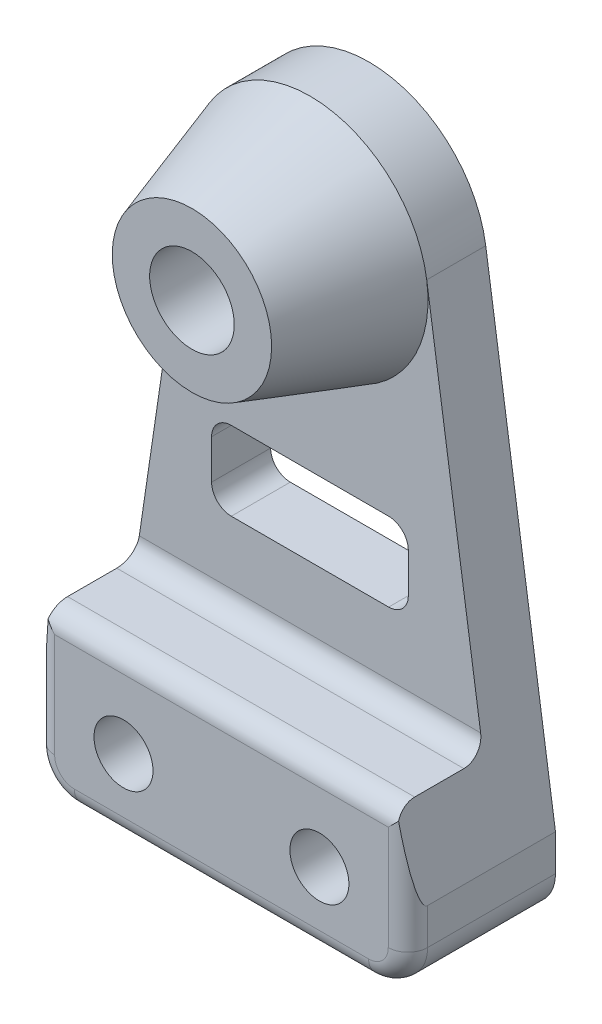
ISO-10303-21;
HEADER;
FILE_DESCRIPTION(('STEP AP214'),'2;1');
FILE_NAME('part.step','',(''),(''),'','','');
FILE_SCHEMA(('AUTOMOTIVE_DESIGN { 1 0 10303 214 1 1 1 1 }'));
ENDSEC;
DATA;
#1=APPLICATION_CONTEXT('core data for automotive mechanical design processes');
#2=APPLICATION_PROTOCOL_DEFINITION('international standard','automotive_design',2000,#1);
#3=PRODUCT_CONTEXT('',#1,'mechanical');
#4=PRODUCT('Part','Part','',(#3));
#5=PRODUCT_RELATED_PRODUCT_CATEGORY('part','',(#4));
#6=PRODUCT_DEFINITION_FORMATION('','',#4);
#7=PRODUCT_DEFINITION_CONTEXT('part definition',#1,'design');
#8=PRODUCT_DEFINITION('design','',#6,#7);
#9=PRODUCT_DEFINITION_SHAPE('','',#8);
#10=(LENGTH_UNIT() NAMED_UNIT(*) SI_UNIT(.MILLI.,.METRE.));
#11=(NAMED_UNIT(*) PLANE_ANGLE_UNIT() SI_UNIT($,.RADIAN.));
#12=(NAMED_UNIT(*) SI_UNIT($,.STERADIAN.) SOLID_ANGLE_UNIT());
#13=UNCERTAINTY_MEASURE_WITH_UNIT(LENGTH_MEASURE(1.E-05),#10,'distance_accuracy_value','');
#14=(GEOMETRIC_REPRESENTATION_CONTEXT(3) GLOBAL_UNCERTAINTY_ASSIGNED_CONTEXT((#13)) GLOBAL_UNIT_ASSIGNED_CONTEXT((#10,
#11,#12)) REPRESENTATION_CONTEXT('',''));
#15=CARTESIAN_POINT('',(0.,0.,0.));
#16=DIRECTION('',(0.,0.,1.));
#17=DIRECTION('',(1.,0.,0.));
#18=AXIS2_PLACEMENT_3D('',#15,#16,#17);
#19=CARTESIAN_POINT('',(0.,0.,3.));
#20=DIRECTION('',(0.,0.,1.));
#21=DIRECTION('',(1.,0.,0.));
#22=AXIS2_PLACEMENT_3D('',#19,#20,#21);
#23=PLANE('',#22);
#24=CARTESIAN_POINT('',(-4.,-11.5,3.));
#25=DIRECTION('',(0.,0.,1.));
#26=DIRECTION('',(1.,0.,0.));
#27=AXIS2_PLACEMENT_3D('',#24,#25,#26);
#28=CIRCLE('',#27,0.999999999999999);
#29=CARTESIAN_POINT('',(-4.,-10.5,3.));
#30=VERTEX_POINT('',#29);
#31=CARTESIAN_POINT('',(-5.,-11.5,3.));
#32=VERTEX_POINT('',#31);
#33=EDGE_CURVE('E215',#30,#32,#28,.T.);
#34=ORIENTED_EDGE('',*,*,#33,.F.);
#35=DIRECTION('',(-1.,0.,0.));
#36=VECTOR('',#35,1.);
#37=CARTESIAN_POINT('',(-4.,-10.5,3.));
#38=LINE('',#37,#36);
#39=CARTESIAN_POINT('',(4.,-10.5,3.));
#40=VERTEX_POINT('',#39);
#41=EDGE_CURVE('E234',#40,#30,#38,.T.);
#42=ORIENTED_EDGE('',*,*,#41,.F.);
#43=CARTESIAN_POINT('',(4.,-11.5,3.));
#44=DIRECTION('',(0.,0.,1.));
#45=DIRECTION('',(-1.,0.,0.));
#46=AXIS2_PLACEMENT_3D('',#43,#44,#45);
#47=CIRCLE('',#46,0.999999999999999);
#48=CARTESIAN_POINT('',(5.,-11.5,3.));
#49=VERTEX_POINT('',#48);
#50=EDGE_CURVE('E231',#49,#40,#47,.T.);
#51=ORIENTED_EDGE('',*,*,#50,.F.);
#52=DIRECTION('',(0.,1.,0.));
#53=VECTOR('',#52,1.);
#54=CARTESIAN_POINT('',(5.,-11.5,3.));
#55=LINE('',#54,#53);
#56=CARTESIAN_POINT('',(5.,-13.5,3.));
#57=VERTEX_POINT('',#56);
#58=EDGE_CURVE('E228',#57,#49,#55,.T.);
#59=ORIENTED_EDGE('',*,*,#58,.F.);
#60=CARTESIAN_POINT('',(4.,-13.5,3.));
#61=DIRECTION('',(0.,0.,1.));
#62=DIRECTION('',(1.,0.,0.));
#63=AXIS2_PLACEMENT_3D('',#60,#61,#62);
#64=CIRCLE('',#63,1.);
#65=CARTESIAN_POINT('',(4.,-14.5,3.));
#66=VERTEX_POINT('',#65);
#67=EDGE_CURVE('E222',#66,#57,#64,.T.);
#68=ORIENTED_EDGE('',*,*,#67,.F.);
#69=DIRECTION('',(1.,0.,0.));
#70=VECTOR('',#69,1.);
#71=CARTESIAN_POINT('',(-4.,-14.5,3.));
#72=LINE('',#71,#70);
#73=CARTESIAN_POINT('',(-4.,-14.5,3.));
#74=VERTEX_POINT('',#73);
#75=EDGE_CURVE('E220',#74,#66,#72,.T.);
#76=ORIENTED_EDGE('',*,*,#75,.F.);
#77=CARTESIAN_POINT('',(-4.,-13.5,3.));
#78=DIRECTION('',(0.,0.,1.));
#79=DIRECTION('',(-1.,0.,0.));
#80=AXIS2_PLACEMENT_3D('',#77,#78,#79);
#81=CIRCLE('',#80,1.);
#82=CARTESIAN_POINT('',(-5.,-13.5,3.));
#83=VERTEX_POINT('',#82);
#84=EDGE_CURVE('E199',#83,#74,#81,.T.);
#85=ORIENTED_EDGE('',*,*,#84,.F.);
#86=DIRECTION('',(0.,-1.,0.));
#87=VECTOR('',#86,1.);
#88=CARTESIAN_POINT('',(-5.,-11.5,3.));
#89=LINE('',#88,#87);
#90=EDGE_CURVE('E210',#32,#83,#89,.T.);
#91=ORIENTED_EDGE('',*,*,#90,.F.);
#92=EDGE_LOOP('',(#34,#42,#51,#59,#68,#76,#85,#91));
#93=FACE_BOUND('',#92,.T.);
#94=DIRECTION('',(-0.14593962685344,-0.989293498065098,0.));
#95=VECTOR('',#94,1.);
#96=CARTESIAN_POINT('',(-5.93576098839059,0.875637761120637,3.));
#97=LINE('',#96,#95);
#98=CARTESIAN_POINT('',(-5.93576098839059,0.875637761120637,3.));
#99=VERTEX_POINT('',#98);
#100=CARTESIAN_POINT('',(-8.67602123342884,-17.7,3.));
#101=VERTEX_POINT('',#100);
#102=EDGE_CURVE('E269',#99,#101,#97,.T.);
#103=ORIENTED_EDGE('',*,*,#102,.T.);
#104=DIRECTION('',(-1.,0.,0.));
#105=VECTOR('',#104,1.);
#106=CARTESIAN_POINT('',(0.,-17.7,3.));
#107=LINE('',#106,#105);
#108=CARTESIAN_POINT('',(8.67602123342884,-17.7,3.));
#109=VERTEX_POINT('',#108);
#110=EDGE_CURVE('E348',#101,#109,#107,.F.);
#111=ORIENTED_EDGE('',*,*,#110,.T.);
#112=DIRECTION('',(-0.14593962685344,0.989293498065098,0.));
#113=VECTOR('',#112,1.);
#114=CARTESIAN_POINT('',(9.48,-23.15,3.));
#115=LINE('',#114,#113);
#116=CARTESIAN_POINT('',(5.93576098839059,0.875637761120639,3.));
#117=VERTEX_POINT('',#116);
#118=EDGE_CURVE('E272',#109,#117,#115,.T.);
#119=ORIENTED_EDGE('',*,*,#118,.T.);
#120=CARTESIAN_POINT('',(0.,0.,3.));
#121=DIRECTION('',(0.,0.,1.));
#122=DIRECTION('',(1.,0.,0.));
#123=AXIS2_PLACEMENT_3D('',#120,#121,#122);
#124=CIRCLE('',#123,6.);
#125=EDGE_CURVE('E256',#99,#117,#124,.T.);
#126=ORIENTED_EDGE('',*,*,#125,.F.);
#127=EDGE_LOOP('',(#103,#111,#119,#126));
#128=FACE_BOUND('',#127,.T.);
#129=ADVANCED_FACE('F38',(#93,#128),#23,.T.);
#130=CARTESIAN_POINT('',(0.,0.,0.));
#131=DIRECTION('',(0.,0.,1.));
#132=DIRECTION('',(1.,0.,0.));
#133=AXIS2_PLACEMENT_3D('',#130,#131,#132);
#134=PLANE('',#133);
#135=DIRECTION('',(1.,0.,0.));
#136=VECTOR('',#135,1.);
#137=CARTESIAN_POINT('',(-4.,-10.5,0.));
#138=LINE('',#137,#136);
#139=CARTESIAN_POINT('',(-4.,-10.5,0.));
#140=VERTEX_POINT('',#139);
#141=CARTESIAN_POINT('',(4.,-10.5,0.));
#142=VERTEX_POINT('',#141);
#143=EDGE_CURVE('E507',#140,#142,#138,.T.);
#144=ORIENTED_EDGE('',*,*,#143,.F.);
#145=CARTESIAN_POINT('',(-4.,-11.5,0.));
#146=DIRECTION('',(0.,0.,1.));
#147=DIRECTION('',(1.,0.,0.));
#148=AXIS2_PLACEMENT_3D('',#145,#146,#147);
#149=CIRCLE('',#148,0.999999999999999);
#150=CARTESIAN_POINT('',(-5.,-11.5,0.));
#151=VERTEX_POINT('',#150);
#152=EDGE_CURVE('E252',#151,#140,#149,.F.);
#153=ORIENTED_EDGE('',*,*,#152,.F.);
#154=DIRECTION('',(0.,1.,0.));
#155=VECTOR('',#154,1.);
#156=CARTESIAN_POINT('',(-5.,-11.5,0.));
#157=LINE('',#156,#155);
#158=CARTESIAN_POINT('',(-5.,-13.5,0.));
#159=VERTEX_POINT('',#158);
#160=EDGE_CURVE('E249',#159,#151,#157,.T.);
#161=ORIENTED_EDGE('',*,*,#160,.F.);
#162=CARTESIAN_POINT('',(-4.,-13.5,0.));
#163=DIRECTION('',(0.,0.,1.));
#164=DIRECTION('',(1.,0.,0.));
#165=AXIS2_PLACEMENT_3D('',#162,#163,#164);
#166=CIRCLE('',#165,1.);
#167=CARTESIAN_POINT('',(-4.,-14.5,0.));
#168=VERTEX_POINT('',#167);
#169=EDGE_CURVE('E202',#168,#159,#166,.F.);
#170=ORIENTED_EDGE('',*,*,#169,.F.);
#171=DIRECTION('',(-1.,0.,0.));
#172=VECTOR('',#171,1.);
#173=CARTESIAN_POINT('',(-4.,-14.5,0.));
#174=LINE('',#173,#172);
#175=CARTESIAN_POINT('',(4.,-14.5,0.));
#176=VERTEX_POINT('',#175);
#177=EDGE_CURVE('E499',#176,#168,#174,.T.);
#178=ORIENTED_EDGE('',*,*,#177,.F.);
#179=CARTESIAN_POINT('',(4.,-13.5,0.));
#180=DIRECTION('',(0.,0.,1.));
#181=DIRECTION('',(1.,0.,0.));
#182=AXIS2_PLACEMENT_3D('',#179,#180,#181);
#183=CIRCLE('',#182,1.);
#184=CARTESIAN_POINT('',(5.,-13.5,0.));
#185=VERTEX_POINT('',#184);
#186=EDGE_CURVE('E501',#185,#176,#183,.F.);
#187=ORIENTED_EDGE('',*,*,#186,.F.);
#188=DIRECTION('',(0.,-1.,0.));
#189=VECTOR('',#188,1.);
#190=CARTESIAN_POINT('',(5.,-11.5,0.));
#191=LINE('',#190,#189);
#192=CARTESIAN_POINT('',(5.,-11.5,0.));
#193=VERTEX_POINT('',#192);
#194=EDGE_CURVE('E503',#193,#185,#191,.T.);
#195=ORIENTED_EDGE('',*,*,#194,.F.);
#196=CARTESIAN_POINT('',(4.,-11.5,0.));
#197=DIRECTION('',(0.,0.,1.));
#198=DIRECTION('',(1.,0.,0.));
#199=AXIS2_PLACEMENT_3D('',#196,#197,#198);
#200=CIRCLE('',#199,0.999999999999999);
#201=EDGE_CURVE('E505',#142,#193,#200,.F.);
#202=ORIENTED_EDGE('',*,*,#201,.F.);
#203=EDGE_LOOP('',(#144,#153,#161,#170,#178,#187,#195,#202));
#204=FACE_BOUND('',#203,.T.);
#205=CARTESIAN_POINT('',(0.,0.,0.));
#206=DIRECTION('',(0.,0.,1.));
#207=DIRECTION('',(1.,0.,0.));
#208=AXIS2_PLACEMENT_3D('',#205,#206,#207);
#209=CIRCLE('',#208,6.);
#210=CARTESIAN_POINT('',(5.93576098839059,0.875637761120637,0.));
#211=VERTEX_POINT('',#210);
#212=CARTESIAN_POINT('',(-5.93576098839059,0.875637761120637,0.));
#213=VERTEX_POINT('',#212);
#214=EDGE_CURVE('E268',#211,#213,#209,.T.);
#215=ORIENTED_EDGE('',*,*,#214,.F.);
#216=DIRECTION('',(-0.14593962685344,0.989293498065098,0.));
#217=VECTOR('',#216,1.);
#218=CARTESIAN_POINT('',(9.48,-23.15,0.));
#219=LINE('',#218,#217);
#220=CARTESIAN_POINT('',(9.48,-23.15,0.));
#221=VERTEX_POINT('',#220);
#222=EDGE_CURVE('E273',#221,#211,#219,.T.);
#223=ORIENTED_EDGE('',*,*,#222,.F.);
#224=DIRECTION('',(0.,1.,0.));
#225=VECTOR('',#224,1.);
#226=CARTESIAN_POINT('',(9.48,-23.15,0.));
#227=LINE('',#226,#225);
#228=CARTESIAN_POINT('',(9.47999999999998,-25.,0.));
#229=VERTEX_POINT('',#228);
#230=EDGE_CURVE('E294',#229,#221,#227,.T.);
#231=ORIENTED_EDGE('',*,*,#230,.F.);
#232=CARTESIAN_POINT('',(7.47999999999999,-25.,0.));
#233=DIRECTION('',(0.,0.,1.));
#234=DIRECTION('',(-1.,0.,0.));
#235=AXIS2_PLACEMENT_3D('',#232,#233,#234);
#236=CIRCLE('',#235,2.);
#237=CARTESIAN_POINT('',(7.47999999999999,-27.,0.));
#238=VERTEX_POINT('',#237);
#239=EDGE_CURVE('E291',#238,#229,#236,.T.);
#240=ORIENTED_EDGE('',*,*,#239,.F.);
#241=DIRECTION('',(1.,0.,0.));
#242=VECTOR('',#241,1.);
#243=CARTESIAN_POINT('',(-7.47999999999998,-27.,0.));
#244=LINE('',#243,#242);
#245=CARTESIAN_POINT('',(-7.47999999999998,-27.,0.));
#246=VERTEX_POINT('',#245);
#247=EDGE_CURVE('E288',#246,#238,#244,.T.);
#248=ORIENTED_EDGE('',*,*,#247,.F.);
#249=CARTESIAN_POINT('',(-7.47999999999998,-25.,0.));
#250=DIRECTION('',(0.,0.,1.));
#251=DIRECTION('',(-1.,0.,0.));
#252=AXIS2_PLACEMENT_3D('',#249,#250,#251);
#253=CIRCLE('',#252,2.);
#254=CARTESIAN_POINT('',(-9.47999999999998,-25.,0.));
#255=VERTEX_POINT('',#254);
#256=EDGE_CURVE('E285',#255,#246,#253,.T.);
#257=ORIENTED_EDGE('',*,*,#256,.F.);
#258=DIRECTION('',(0.,-1.,0.));
#259=VECTOR('',#258,1.);
#260=CARTESIAN_POINT('',(-9.48,-23.15,0.));
#261=LINE('',#260,#259);
#262=CARTESIAN_POINT('',(-9.48,-23.15,0.));
#263=VERTEX_POINT('',#262);
#264=EDGE_CURVE('E282',#263,#255,#261,.T.);
#265=ORIENTED_EDGE('',*,*,#264,.F.);
#266=DIRECTION('',(-0.14593962685344,-0.989293498065098,0.));
#267=VECTOR('',#266,1.);
#268=CARTESIAN_POINT('',(-5.93576098839059,0.875637761120637,0.));
#269=LINE('',#268,#267);
#270=EDGE_CURVE('E279',#213,#263,#269,.T.);
#271=ORIENTED_EDGE('',*,*,#270,.F.);
#272=EDGE_LOOP('',(#215,#223,#231,#240,#248,#257,#265,#271));
#273=FACE_BOUND('',#272,.T.);
#274=CARTESIAN_POINT('',(0.,0.,0.));
#275=DIRECTION('',(0.,0.,1.));
#276=DIRECTION('',(1.,0.,0.));
#277=AXIS2_PLACEMENT_3D('',#274,#275,#276);
#278=CIRCLE('',#277,2.15);
#279=CARTESIAN_POINT('',(2.15,0.,0.));
#280=VERTEX_POINT('',#279);
#281=EDGE_CURVE('E265',#280,#280,#278,.T.);
#282=ORIENTED_EDGE('',*,*,#281,.T.);
#283=EDGE_LOOP('',(#282));
#284=FACE_BOUND('',#283,.T.);
#285=CARTESIAN_POINT('',(4.98,-23.2,0.));
#286=DIRECTION('',(0.,0.,1.));
#287=DIRECTION('',(1.,0.,0.));
#288=AXIS2_PLACEMENT_3D('',#285,#286,#287);
#289=CIRCLE('',#288,1.5);
#290=CARTESIAN_POINT('',(6.48,-23.2,0.));
#291=VERTEX_POINT('',#290);
#292=EDGE_CURVE('E262',#291,#291,#289,.T.);
#293=ORIENTED_EDGE('',*,*,#292,.T.);
#294=EDGE_LOOP('',(#293));
#295=FACE_BOUND('',#294,.T.);
#296=CARTESIAN_POINT('',(-4.98,-23.2,0.));
#297=DIRECTION('',(0.,0.,1.));
#298=DIRECTION('',(1.,0.,0.));
#299=AXIS2_PLACEMENT_3D('',#296,#297,#298);
#300=CIRCLE('',#299,1.5);
#301=CARTESIAN_POINT('',(-3.48,-23.2,0.));
#302=VERTEX_POINT('',#301);
#303=EDGE_CURVE('E255',#302,#302,#300,.T.);
#304=ORIENTED_EDGE('',*,*,#303,.T.);
#305=EDGE_LOOP('',(#304));
#306=FACE_BOUND('',#305,.T.);
#307=ADVANCED_FACE('F386',(#204,#273,#284,#295,#306),#134,.F.);
#308=CARTESIAN_POINT('',(0.,0.,3.));
#309=DIRECTION('',(0.,0.,-1.));
#310=DIRECTION('',(-1.,0.,0.));
#311=AXIS2_PLACEMENT_3D('',#308,#309,#310);
#312=CYLINDRICAL_SURFACE('',#311,6.);
#313=DIRECTION('',(0.,0.,-1.));
#314=VECTOR('',#313,1.);
#315=CARTESIAN_POINT('',(-5.93576098839059,0.875637761120637,3.));
#316=LINE('',#315,#314);
#317=EDGE_CURVE('E259',#99,#213,#316,.T.);
#318=ORIENTED_EDGE('',*,*,#317,.F.);
#319=CARTESIAN_POINT('',(0.,0.,2.99999999999996));
#320=DIRECTION('',(0.,0.,1.));
#321=DIRECTION('',(1.,0.,0.));
#322=AXIS2_PLACEMENT_3D('',#319,#320,#321);
#323=CIRCLE('',#322,6.);
#324=EDGE_CURVE('E11',#99,#117,#323,.F.);
#325=ORIENTED_EDGE('',*,*,#324,.T.);
#326=DIRECTION('',(0.,0.,-1.));
#327=VECTOR('',#326,1.);
#328=CARTESIAN_POINT('',(5.93576098839059,0.875637761120637,3.));
#329=LINE('',#328,#327);
#330=EDGE_CURVE('E276',#117,#211,#329,.T.);
#331=ORIENTED_EDGE('',*,*,#330,.T.);
#332=ORIENTED_EDGE('',*,*,#214,.T.);
#333=EDGE_LOOP('',(#318,#325,#331,#332));
#334=FACE_BOUND('',#333,.T.);
#335=ADVANCED_FACE('F391',(#334),#312,.T.);
#336=CARTESIAN_POINT('',(-5.93576098839059,0.875637761120637,3.));
#337=DIRECTION('',(0.989293498065098,-0.14593962685344,0.));
#338=DIRECTION('',(0.14593962685344,0.989293498065098,0.));
#339=AXIS2_PLACEMENT_3D('',#336,#337,#338);
#340=PLANE('',#339);
#341=DIRECTION('',(0.,0.,-1.));
#342=VECTOR('',#341,1.);
#343=CARTESIAN_POINT('',(-9.48,-23.15,3.));
#344=LINE('',#343,#342);
#345=CARTESIAN_POINT('',(-9.48,-23.15,6.5));
#346=VERTEX_POINT('',#345);
#347=EDGE_CURVE('E310',#346,#263,#344,.T.);
#348=ORIENTED_EDGE('',*,*,#347,.F.);
#349=CARTESIAN_POINT('',(-8.48000000000007,-16.3712140088687,6.5));
#350=DIRECTION('',(0.989293498065098,-0.14593962685344,0.));
#351=DIRECTION('',(0.14593962685344,0.989293498065098,0.));
#352=AXIS2_PLACEMENT_3D('',#349,#350,#351);
#353=ELLIPSE('',#352,6.85214853265446,1.);
#354=CARTESIAN_POINT('',(-8.90793129865339,-19.2720687013466,7.40381126549344));
#355=VERTEX_POINT('',#354);
#356=EDGE_CURVE('E331',#346,#355,#353,.F.);
#357=ORIENTED_EDGE('',*,*,#356,.T.);
#358=CARTESIAN_POINT('',(-8.97105931290449,-19.7,6.5));
#359=DIRECTION('',(0.989293498065098,-0.14593962685344,0.));
#360=DIRECTION('',(0.14593962685344,0.989293498065098,0.));
#361=AXIS2_PLACEMENT_3D('',#358,#359,#360);
#362=ELLIPSE('',#361,1.01082237167821,1.);
#363=CARTESIAN_POINT('',(-8.82354027316667,-18.7,6.5));
#364=VERTEX_POINT('',#363);
#365=EDGE_CURVE('E329',#355,#364,#362,.F.);
#366=ORIENTED_EDGE('',*,*,#365,.T.);
#367=DIRECTION('',(0.,0.,-1.));
#368=VECTOR('',#367,1.);
#369=CARTESIAN_POINT('',(-8.82354027316667,-18.7,7.5));
#370=LINE('',#369,#368);
#371=CARTESIAN_POINT('',(-8.82354027316667,-18.7,4.));
#372=VERTEX_POINT('',#371);
#373=EDGE_CURVE('E486',#364,#372,#370,.T.);
#374=ORIENTED_EDGE('',*,*,#373,.T.);
#375=CARTESIAN_POINT('',(-8.67602123342884,-17.7,4.));
#376=DIRECTION('',(0.989293498065098,-0.14593962685344,0.));
#377=DIRECTION('',(-0.14593962685344,-0.989293498065098,0.));
#378=AXIS2_PLACEMENT_3D('',#375,#376,#377);
#379=ELLIPSE('',#378,1.01082237167821,1.);
#380=EDGE_CURVE('E350',#372,#101,#379,.T.);
#381=ORIENTED_EDGE('',*,*,#380,.T.);
#382=ORIENTED_EDGE('',*,*,#102,.F.);
#383=ORIENTED_EDGE('',*,*,#317,.T.);
#384=ORIENTED_EDGE('',*,*,#270,.T.);
#385=EDGE_LOOP('',(#348,#357,#366,#374,#381,#382,#383,#384));
#386=FACE_BOUND('',#385,.T.);
#387=ADVANCED_FACE('F419',(#386),#340,.F.);
#388=CARTESIAN_POINT('',(-9.48,-23.15,3.));
#389=DIRECTION('',(1.,0.,0.));
#390=DIRECTION('',(0.,1.,0.));
#391=AXIS2_PLACEMENT_3D('',#388,#389,#390);
#392=PLANE('',#391);
#393=DIRECTION('',(0.,0.,-1.));
#394=VECTOR('',#393,1.);
#395=CARTESIAN_POINT('',(-9.47999999999998,-25.,3.));
#396=LINE('',#395,#394);
#397=CARTESIAN_POINT('',(-9.47999999999998,-25.,6.5));
#398=VERTEX_POINT('',#397);
#399=EDGE_CURVE('E308',#398,#255,#396,.T.);
#400=ORIENTED_EDGE('',*,*,#399,.F.);
#401=DIRECTION('',(0.,-1.,0.));
#402=VECTOR('',#401,1.);
#403=CARTESIAN_POINT('',(-9.48,-23.1499999999994,6.5));
#404=LINE('',#403,#402);
#405=EDGE_CURVE('E326',#398,#346,#404,.F.);
#406=ORIENTED_EDGE('',*,*,#405,.T.);
#407=ORIENTED_EDGE('',*,*,#347,.T.);
#408=ORIENTED_EDGE('',*,*,#264,.T.);
#409=EDGE_LOOP('',(#400,#406,#407,#408));
#410=FACE_BOUND('',#409,.T.);
#411=ADVANCED_FACE('F415',(#410),#392,.F.);
#412=CARTESIAN_POINT('',(-7.47999999999998,-25.,3.));
#413=DIRECTION('',(0.,0.,-1.));
#414=DIRECTION('',(-1.,0.,0.));
#415=AXIS2_PLACEMENT_3D('',#412,#413,#414);
#416=CYLINDRICAL_SURFACE('',#415,2.);
#417=DIRECTION('',(0.,0.,-1.));
#418=VECTOR('',#417,1.);
#419=CARTESIAN_POINT('',(-7.47999999999998,-27.,3.));
#420=LINE('',#419,#418);
#421=CARTESIAN_POINT('',(-7.47999999999998,-27.,6.5));
#422=VERTEX_POINT('',#421);
#423=EDGE_CURVE('E306',#422,#246,#420,.T.);
#424=ORIENTED_EDGE('',*,*,#423,.F.);
#425=CARTESIAN_POINT('',(-7.47999999999998,-25.,6.5));
#426=DIRECTION('',(0.,0.,1.));
#427=DIRECTION('',(1.,0.,0.));
#428=AXIS2_PLACEMENT_3D('',#425,#426,#427);
#429=CIRCLE('',#428,2.);
#430=EDGE_CURVE('E333',#422,#398,#429,.F.);
#431=ORIENTED_EDGE('',*,*,#430,.T.);
#432=ORIENTED_EDGE('',*,*,#399,.T.);
#433=ORIENTED_EDGE('',*,*,#256,.T.);
#434=EDGE_LOOP('',(#424,#431,#432,#433));
#435=FACE_BOUND('',#434,.T.);
#436=ADVANCED_FACE('F411',(#435),#416,.T.);
#437=CARTESIAN_POINT('',(-7.47999999999998,-27.,3.));
#438=DIRECTION('',(0.,1.,0.));
#439=DIRECTION('',(0.,0.,1.));
#440=AXIS2_PLACEMENT_3D('',#437,#438,#439);
#441=PLANE('',#440);
#442=DIRECTION('',(0.,0.,-1.));
#443=VECTOR('',#442,1.);
#444=CARTESIAN_POINT('',(7.47999999999999,-27.,3.));
#445=LINE('',#444,#443);
#446=CARTESIAN_POINT('',(7.47999999999999,-27.,6.5));
#447=VERTEX_POINT('',#446);
#448=EDGE_CURVE('E304',#447,#238,#445,.T.);
#449=ORIENTED_EDGE('',*,*,#448,.F.);
#450=DIRECTION('',(1.,0.,0.));
#451=VECTOR('',#450,1.);
#452=CARTESIAN_POINT('',(-7.48000000000051,-27.,6.5));
#453=LINE('',#452,#451);
#454=EDGE_CURVE('E341',#447,#422,#453,.F.);
#455=ORIENTED_EDGE('',*,*,#454,.T.);
#456=ORIENTED_EDGE('',*,*,#423,.T.);
#457=ORIENTED_EDGE('',*,*,#247,.T.);
#458=EDGE_LOOP('',(#449,#455,#456,#457));
#459=FACE_BOUND('',#458,.T.);
#460=ADVANCED_FACE('F408',(#459),#441,.F.);
#461=CARTESIAN_POINT('',(7.47999999999999,-25.,3.));
#462=DIRECTION('',(0.,0.,-1.));
#463=DIRECTION('',(-1.,0.,0.));
#464=AXIS2_PLACEMENT_3D('',#461,#462,#463);
#465=CYLINDRICAL_SURFACE('',#464,2.);
#466=DIRECTION('',(0.,0.,-1.));
#467=VECTOR('',#466,1.);
#468=CARTESIAN_POINT('',(9.47999999999998,-25.,3.));
#469=LINE('',#468,#467);
#470=CARTESIAN_POINT('',(9.47999999999998,-25.,6.5));
#471=VERTEX_POINT('',#470);
#472=EDGE_CURVE('E302',#471,#229,#469,.T.);
#473=ORIENTED_EDGE('',*,*,#472,.F.);
#474=CARTESIAN_POINT('',(7.47999999999999,-25.,6.5));
#475=DIRECTION('',(0.,0.,1.));
#476=DIRECTION('',(1.,0.,0.));
#477=AXIS2_PLACEMENT_3D('',#474,#475,#476);
#478=CIRCLE('',#477,2.);
#479=EDGE_CURVE('E53',#471,#447,#478,.F.);
#480=ORIENTED_EDGE('',*,*,#479,.T.);
#481=ORIENTED_EDGE('',*,*,#448,.T.);
#482=ORIENTED_EDGE('',*,*,#239,.T.);
#483=EDGE_LOOP('',(#473,#480,#481,#482));
#484=FACE_BOUND('',#483,.T.);
#485=ADVANCED_FACE('F405',(#484),#465,.T.);
#486=CARTESIAN_POINT('',(9.48,-23.15,3.));
#487=DIRECTION('',(-1.,0.,0.));
#488=DIRECTION('',(0.,-1.,0.));
#489=AXIS2_PLACEMENT_3D('',#486,#487,#488);
#490=PLANE('',#489);
#491=DIRECTION('',(0.,0.,-1.));
#492=VECTOR('',#491,1.);
#493=CARTESIAN_POINT('',(9.48,-23.15,3.));
#494=LINE('',#493,#492);
#495=CARTESIAN_POINT('',(9.48,-23.15,6.5));
#496=VERTEX_POINT('',#495);
#497=EDGE_CURVE('E300',#496,#221,#494,.T.);
#498=ORIENTED_EDGE('',*,*,#497,.F.);
#499=DIRECTION('',(0.,1.,0.));
#500=VECTOR('',#499,1.);
#501=CARTESIAN_POINT('',(9.47999999999998,-25.,6.5));
#502=LINE('',#501,#500);
#503=EDGE_CURVE('E61',#496,#471,#502,.F.);
#504=ORIENTED_EDGE('',*,*,#503,.T.);
#505=ORIENTED_EDGE('',*,*,#472,.T.);
#506=ORIENTED_EDGE('',*,*,#230,.T.);
#507=EDGE_LOOP('',(#498,#504,#505,#506));
#508=FACE_BOUND('',#507,.T.);
#509=ADVANCED_FACE('F401',(#508),#490,.F.);
#510=CARTESIAN_POINT('',(9.48,-23.15,3.));
#511=DIRECTION('',(-0.989293498065098,-0.14593962685344,0.));
#512=DIRECTION('',(0.14593962685344,-0.989293498065098,0.));
#513=AXIS2_PLACEMENT_3D('',#510,#511,#512);
#514=PLANE('',#513);
#515=CARTESIAN_POINT('',(8.97105931290449,-19.7,6.5));
#516=DIRECTION('',(-0.989293498065098,-0.14593962685344,0.));
#517=DIRECTION('',(0.14593962685344,-0.989293498065098,0.));
#518=AXIS2_PLACEMENT_3D('',#515,#516,#517);
#519=ELLIPSE('',#518,1.01082237167821,1.);
#520=CARTESIAN_POINT('',(8.82354027316666,-18.7,6.5));
#521=VERTEX_POINT('',#520);
#522=CARTESIAN_POINT('',(8.90793129865339,-19.2720687013466,7.40381126549344));
#523=VERTEX_POINT('',#522);
#524=EDGE_CURVE('E335',#521,#523,#519,.F.);
#525=ORIENTED_EDGE('',*,*,#524,.T.);
#526=CARTESIAN_POINT('',(8.48000000000006,-16.3712140088686,6.5));
#527=DIRECTION('',(-0.989293498065098,-0.14593962685344,0.));
#528=DIRECTION('',(0.14593962685344,-0.989293498065098,0.));
#529=AXIS2_PLACEMENT_3D('',#526,#527,#528);
#530=ELLIPSE('',#529,6.8521485326545,1.);
#531=EDGE_CURVE('E337',#523,#496,#530,.F.);
#532=ORIENTED_EDGE('',*,*,#531,.T.);
#533=ORIENTED_EDGE('',*,*,#497,.T.);
#534=ORIENTED_EDGE('',*,*,#222,.T.);
#535=ORIENTED_EDGE('',*,*,#330,.F.);
#536=ORIENTED_EDGE('',*,*,#118,.F.);
#537=CARTESIAN_POINT('',(8.67602123342884,-17.7,4.));
#538=DIRECTION('',(-0.989293498065098,-0.14593962685344,0.));
#539=DIRECTION('',(-0.14593962685344,0.989293498065098,0.));
#540=AXIS2_PLACEMENT_3D('',#537,#538,#539);
#541=ELLIPSE('',#540,1.01082237167821,1.);
#542=CARTESIAN_POINT('',(8.82354027316666,-18.7,4.));
#543=VERTEX_POINT('',#542);
#544=EDGE_CURVE('E352',#109,#543,#541,.T.);
#545=ORIENTED_EDGE('',*,*,#544,.T.);
#546=DIRECTION('',(0.,0.,-1.));
#547=VECTOR('',#546,1.);
#548=CARTESIAN_POINT('',(8.82354027316666,-18.7,7.5));
#549=LINE('',#548,#547);
#550=EDGE_CURVE('E488',#521,#543,#549,.T.);
#551=ORIENTED_EDGE('',*,*,#550,.F.);
#552=EDGE_LOOP('',(#525,#532,#533,#534,#535,#536,#545,#551));
#553=FACE_BOUND('',#552,.T.);
#554=ADVANCED_FACE('F398',(#553),#514,.F.);
#555=CARTESIAN_POINT('',(0.,0.,3.));
#556=DIRECTION('',(0.,0.,-1.));
#557=DIRECTION('',(-1.,0.,0.));
#558=AXIS2_PLACEMENT_3D('',#555,#556,#557);
#559=CYLINDRICAL_SURFACE('',#558,2.15);
#560=ORIENTED_EDGE('',*,*,#281,.F.);
#561=EDGE_LOOP('',(#560));
#562=FACE_BOUND('',#561,.T.);
#563=CARTESIAN_POINT('',(0.,0.,9.));
#564=DIRECTION('',(0.,0.,1.));
#565=DIRECTION('',(1.,0.,0.));
#566=AXIS2_PLACEMENT_3D('',#563,#564,#565);
#567=CIRCLE('',#566,2.15);
#568=CARTESIAN_POINT('',(2.15,0.,9.));
#569=VERTEX_POINT('',#568);
#570=EDGE_CURVE('E251',#569,#569,#567,.T.);
#571=ORIENTED_EDGE('',*,*,#570,.T.);
#572=EDGE_LOOP('',(#571));
#573=FACE_BOUND('',#572,.T.);
#574=ADVANCED_FACE('F395',(#562,#573),#559,.F.);
#575=CARTESIAN_POINT('',(4.98,-23.2,3.));
#576=DIRECTION('',(0.,0.,-1.));
#577=DIRECTION('',(-1.,0.,0.));
#578=AXIS2_PLACEMENT_3D('',#575,#576,#577);
#579=CYLINDRICAL_SURFACE('',#578,1.5);
#580=ORIENTED_EDGE('',*,*,#292,.F.);
#581=EDGE_LOOP('',(#580));
#582=FACE_BOUND('',#581,.T.);
#583=CARTESIAN_POINT('',(4.98,-23.2,7.5));
#584=DIRECTION('',(0.,0.,1.));
#585=DIRECTION('',(1.,0.,0.));
#586=AXIS2_PLACEMENT_3D('',#583,#584,#585);
#587=CIRCLE('',#586,1.5);
#588=CARTESIAN_POINT('',(6.48,-23.2,7.5));
#589=VERTEX_POINT('',#588);
#590=EDGE_CURVE('E370',#589,#589,#587,.T.);
#591=ORIENTED_EDGE('',*,*,#590,.T.);
#592=EDGE_LOOP('',(#591));
#593=FACE_BOUND('',#592,.T.);
#594=ADVANCED_FACE('F553',(#582,#593),#579,.F.);
#595=CARTESIAN_POINT('',(-4.98,-23.2,3.));
#596=DIRECTION('',(0.,0.,-1.));
#597=DIRECTION('',(-1.,0.,0.));
#598=AXIS2_PLACEMENT_3D('',#595,#596,#597);
#599=CYLINDRICAL_SURFACE('',#598,1.5);
#600=ORIENTED_EDGE('',*,*,#303,.F.);
#601=EDGE_LOOP('',(#600));
#602=FACE_BOUND('',#601,.T.);
#603=CARTESIAN_POINT('',(-4.98,-23.2,7.5));
#604=DIRECTION('',(0.,0.,1.));
#605=DIRECTION('',(1.,0.,0.));
#606=AXIS2_PLACEMENT_3D('',#603,#604,#605);
#607=CIRCLE('',#606,1.5);
#608=CARTESIAN_POINT('',(-3.48,-23.2,7.5));
#609=VERTEX_POINT('',#608);
#610=EDGE_CURVE('E491',#609,#609,#607,.T.);
#611=ORIENTED_EDGE('',*,*,#610,.T.);
#612=EDGE_LOOP('',(#611));
#613=FACE_BOUND('',#612,.T.);
#614=ADVANCED_FACE('F551',(#602,#613),#599,.F.);
#615=CARTESIAN_POINT('',(0.,0.,9.));
#616=DIRECTION('',(0.,0.,1.));
#617=DIRECTION('',(1.,0.,0.));
#618=AXIS2_PLACEMENT_3D('',#615,#616,#617);
#619=PLANE('',#618);
#620=CARTESIAN_POINT('',(0.,0.,9.));
#621=DIRECTION('',(0.,0.,1.));
#622=DIRECTION('',(1.,0.,0.));
#623=AXIS2_PLACEMENT_3D('',#620,#621,#622);
#624=CIRCLE('',#623,4.05048182260257);
#625=CARTESIAN_POINT('',(4.05048182260257,0.,9.));
#626=VERTEX_POINT('',#625);
#627=EDGE_CURVE('E46',#626,#626,#624,.T.);
#628=ORIENTED_EDGE('',*,*,#627,.T.);
#629=EDGE_LOOP('',(#628));
#630=FACE_BOUND('',#629,.T.);
#631=ORIENTED_EDGE('',*,*,#570,.F.);
#632=EDGE_LOOP('',(#631));
#633=FACE_BOUND('',#632,.T.);
#634=ADVANCED_FACE('F374',(#630,#633),#619,.T.);
#635=CARTESIAN_POINT('',(-4.,-11.5,-10.770329614269));
#636=DIRECTION('',(0.,0.,1.));
#637=DIRECTION('',(1.,0.,0.));
#638=AXIS2_PLACEMENT_3D('',#635,#636,#637);
#639=CYLINDRICAL_SURFACE('',#638,0.999999999999999);
#640=ORIENTED_EDGE('',*,*,#152,.T.);
#641=DIRECTION('',(0.,0.,1.));
#642=VECTOR('',#641,1.);
#643=CARTESIAN_POINT('',(-4.,-10.5,-10.770329614269));
#644=LINE('',#643,#642);
#645=EDGE_CURVE('E237',#140,#30,#644,.T.);
#646=ORIENTED_EDGE('',*,*,#645,.T.);
#647=ORIENTED_EDGE('',*,*,#33,.T.);
#648=DIRECTION('',(0.,0.,1.));
#649=VECTOR('',#648,1.);
#650=CARTESIAN_POINT('',(-5.,-11.5,-10.770329614269));
#651=LINE('',#650,#649);
#652=EDGE_CURVE('E206',#151,#32,#651,.T.);
#653=ORIENTED_EDGE('',*,*,#652,.F.);
#654=EDGE_LOOP('',(#640,#646,#647,#653));
#655=FACE_BOUND('',#654,.T.);
#656=ADVANCED_FACE('F510',(#655),#639,.F.);
#657=CARTESIAN_POINT('',(-4.,-10.5,-10.770329614269));
#658=DIRECTION('',(0.,1.,0.));
#659=DIRECTION('',(0.,0.,1.));
#660=AXIS2_PLACEMENT_3D('',#657,#658,#659);
#661=PLANE('',#660);
#662=ORIENTED_EDGE('',*,*,#143,.T.);
#663=DIRECTION('',(0.,0.,1.));
#664=VECTOR('',#663,1.);
#665=CARTESIAN_POINT('',(4.,-10.5,-10.770329614269));
#666=LINE('',#665,#664);
#667=EDGE_CURVE('E239',#142,#40,#666,.T.);
#668=ORIENTED_EDGE('',*,*,#667,.T.);
#669=ORIENTED_EDGE('',*,*,#41,.T.);
#670=ORIENTED_EDGE('',*,*,#645,.F.);
#671=EDGE_LOOP('',(#662,#668,#669,#670));
#672=FACE_BOUND('',#671,.T.);
#673=ADVANCED_FACE('F517',(#672),#661,.F.);
#674=CARTESIAN_POINT('',(4.,-11.5,-10.770329614269));
#675=DIRECTION('',(0.,0.,1.));
#676=DIRECTION('',(1.,0.,0.));
#677=AXIS2_PLACEMENT_3D('',#674,#675,#676);
#678=CYLINDRICAL_SURFACE('',#677,0.999999999999999);
#679=ORIENTED_EDGE('',*,*,#201,.T.);
#680=DIRECTION('',(0.,0.,1.));
#681=VECTOR('',#680,1.);
#682=CARTESIAN_POINT('',(5.,-11.5,-10.770329614269));
#683=LINE('',#682,#681);
#684=EDGE_CURVE('E241',#193,#49,#683,.T.);
#685=ORIENTED_EDGE('',*,*,#684,.T.);
#686=ORIENTED_EDGE('',*,*,#50,.T.);
#687=ORIENTED_EDGE('',*,*,#667,.F.);
#688=EDGE_LOOP('',(#679,#685,#686,#687));
#689=FACE_BOUND('',#688,.T.);
#690=ADVANCED_FACE('F522',(#689),#678,.F.);
#691=CARTESIAN_POINT('',(5.,-11.5,-10.770329614269));
#692=DIRECTION('',(1.,0.,0.));
#693=DIRECTION('',(0.,0.,-1.));
#694=AXIS2_PLACEMENT_3D('',#691,#692,#693);
#695=PLANE('',#694);
#696=ORIENTED_EDGE('',*,*,#194,.T.);
#697=DIRECTION('',(0.,0.,1.));
#698=VECTOR('',#697,1.);
#699=CARTESIAN_POINT('',(5.,-13.5,-10.770329614269));
#700=LINE('',#699,#698);
#701=EDGE_CURVE('E243',#185,#57,#700,.T.);
#702=ORIENTED_EDGE('',*,*,#701,.T.);
#703=ORIENTED_EDGE('',*,*,#58,.T.);
#704=ORIENTED_EDGE('',*,*,#684,.F.);
#705=EDGE_LOOP('',(#696,#702,#703,#704));
#706=FACE_BOUND('',#705,.T.);
#707=ADVANCED_FACE('F526',(#706),#695,.F.);
#708=CARTESIAN_POINT('',(4.,-13.5,-10.770329614269));
#709=DIRECTION('',(0.,0.,1.));
#710=DIRECTION('',(1.,0.,0.));
#711=AXIS2_PLACEMENT_3D('',#708,#709,#710);
#712=CYLINDRICAL_SURFACE('',#711,1.);
#713=ORIENTED_EDGE('',*,*,#186,.T.);
#714=DIRECTION('',(0.,0.,1.));
#715=VECTOR('',#714,1.);
#716=CARTESIAN_POINT('',(4.,-14.5,-10.770329614269));
#717=LINE('',#716,#715);
#718=EDGE_CURVE('E245',#176,#66,#717,.T.);
#719=ORIENTED_EDGE('',*,*,#718,.T.);
#720=ORIENTED_EDGE('',*,*,#67,.T.);
#721=ORIENTED_EDGE('',*,*,#701,.F.);
#722=EDGE_LOOP('',(#713,#719,#720,#721));
#723=FACE_BOUND('',#722,.T.);
#724=ADVANCED_FACE('F529',(#723),#712,.F.);
#725=CARTESIAN_POINT('',(-4.,-14.5,-10.770329614269));
#726=DIRECTION('',(0.,-1.,0.));
#727=DIRECTION('',(0.,0.,-1.));
#728=AXIS2_PLACEMENT_3D('',#725,#726,#727);
#729=PLANE('',#728);
#730=ORIENTED_EDGE('',*,*,#177,.T.);
#731=DIRECTION('',(0.,0.,1.));
#732=VECTOR('',#731,1.);
#733=CARTESIAN_POINT('',(-4.,-14.5,-10.770329614269));
#734=LINE('',#733,#732);
#735=EDGE_CURVE('E205',#168,#74,#734,.T.);
#736=ORIENTED_EDGE('',*,*,#735,.T.);
#737=ORIENTED_EDGE('',*,*,#75,.T.);
#738=ORIENTED_EDGE('',*,*,#718,.F.);
#739=EDGE_LOOP('',(#730,#736,#737,#738));
#740=FACE_BOUND('',#739,.T.);
#741=ADVANCED_FACE('F534',(#740),#729,.F.);
#742=CARTESIAN_POINT('',(-4.,-13.5,-10.770329614269));
#743=DIRECTION('',(0.,0.,1.));
#744=DIRECTION('',(1.,0.,0.));
#745=AXIS2_PLACEMENT_3D('',#742,#743,#744);
#746=CYLINDRICAL_SURFACE('',#745,1.);
#747=ORIENTED_EDGE('',*,*,#169,.T.);
#748=DIRECTION('',(0.,0.,1.));
#749=VECTOR('',#748,1.);
#750=CARTESIAN_POINT('',(-5.,-13.5,-10.770329614269));
#751=LINE('',#750,#749);
#752=EDGE_CURVE('E194',#159,#83,#751,.T.);
#753=ORIENTED_EDGE('',*,*,#752,.T.);
#754=ORIENTED_EDGE('',*,*,#84,.T.);
#755=ORIENTED_EDGE('',*,*,#735,.F.);
#756=EDGE_LOOP('',(#747,#753,#754,#755));
#757=FACE_BOUND('',#756,.T.);
#758=ADVANCED_FACE('F196',(#757),#746,.F.);
#759=CARTESIAN_POINT('',(-5.,-11.5,-10.770329614269));
#760=DIRECTION('',(-1.,0.,0.));
#761=DIRECTION('',(0.,0.,1.));
#762=AXIS2_PLACEMENT_3D('',#759,#760,#761);
#763=PLANE('',#762);
#764=ORIENTED_EDGE('',*,*,#160,.T.);
#765=ORIENTED_EDGE('',*,*,#652,.T.);
#766=ORIENTED_EDGE('',*,*,#90,.T.);
#767=ORIENTED_EDGE('',*,*,#752,.F.);
#768=EDGE_LOOP('',(#764,#765,#766,#767));
#769=FACE_BOUND('',#768,.T.);
#770=ADVANCED_FACE('F211',(#769),#763,.F.);
#771=CARTESIAN_POINT('',(7.48000000000002,-25.,7.5));
#772=DIRECTION('',(0.,0.,1.));
#773=DIRECTION('',(1.,0.,0.));
#774=AXIS2_PLACEMENT_3D('',#771,#772,#773);
#775=PLANE('',#774);
#776=CARTESIAN_POINT('',(-7.47999999999998,-25.,7.5));
#777=DIRECTION('',(0.,0.,1.));
#778=DIRECTION('',(1.,0.,0.));
#779=AXIS2_PLACEMENT_3D('',#776,#777,#778);
#780=CIRCLE('',#779,1.);
#781=CARTESIAN_POINT('',(-8.47999999999998,-25.,7.5));
#782=VERTEX_POINT('',#781);
#783=CARTESIAN_POINT('',(-7.47999999999998,-26.,7.5));
#784=VERTEX_POINT('',#783);
#785=EDGE_CURVE('E322',#782,#784,#780,.T.);
#786=ORIENTED_EDGE('',*,*,#785,.T.);
#787=DIRECTION('',(1.,0.,0.));
#788=VECTOR('',#787,1.);
#789=CARTESIAN_POINT('',(7.48000000000002,-26.,7.5));
#790=LINE('',#789,#788);
#791=CARTESIAN_POINT('',(7.47999999999999,-26.,7.5));
#792=VERTEX_POINT('',#791);
#793=EDGE_CURVE('E324',#784,#792,#790,.T.);
#794=ORIENTED_EDGE('',*,*,#793,.T.);
#795=CARTESIAN_POINT('',(7.47999999999999,-25.,7.5));
#796=DIRECTION('',(0.,0.,1.));
#797=DIRECTION('',(1.,0.,0.));
#798=AXIS2_PLACEMENT_3D('',#795,#796,#797);
#799=CIRCLE('',#798,1.);
#800=CARTESIAN_POINT('',(8.47999999999999,-25.,7.5));
#801=VERTEX_POINT('',#800);
#802=EDGE_CURVE('E320',#792,#801,#799,.T.);
#803=ORIENTED_EDGE('',*,*,#802,.T.);
#804=DIRECTION('',(0.,1.,0.));
#805=VECTOR('',#804,1.);
#806=CARTESIAN_POINT('',(8.48,-23.15,7.5));
#807=LINE('',#806,#805);
#808=CARTESIAN_POINT('',(8.48000000000003,-19.7,7.5));
#809=VERTEX_POINT('',#808);
#810=EDGE_CURVE('E315',#801,#809,#807,.T.);
#811=ORIENTED_EDGE('',*,*,#810,.T.);
#812=DIRECTION('',(-1.,0.,0.));
#813=VECTOR('',#812,1.);
#814=CARTESIAN_POINT('',(-8.82354027316666,-19.7,7.5));
#815=LINE('',#814,#813);
#816=CARTESIAN_POINT('',(-8.48000000000001,-19.7,7.5));
#817=VERTEX_POINT('',#816);
#818=EDGE_CURVE('E258',#809,#817,#815,.T.);
#819=ORIENTED_EDGE('',*,*,#818,.T.);
#820=DIRECTION('',(0.,-1.,0.));
#821=VECTOR('',#820,1.);
#822=CARTESIAN_POINT('',(-8.47999999999998,-24.9999999999994,7.5));
#823=LINE('',#822,#821);
#824=EDGE_CURVE('E317',#817,#782,#823,.T.);
#825=ORIENTED_EDGE('',*,*,#824,.T.);
#826=EDGE_LOOP('',(#786,#794,#803,#811,#819,#825));
#827=FACE_BOUND('',#826,.T.);
#828=ORIENTED_EDGE('',*,*,#610,.F.);
#829=EDGE_LOOP('',(#828));
#830=FACE_BOUND('',#829,.T.);
#831=ORIENTED_EDGE('',*,*,#590,.F.);
#832=EDGE_LOOP('',(#831));
#833=FACE_BOUND('',#832,.T.);
#834=ADVANCED_FACE('F453',(#827,#830,#833),#775,.T.);
#835=CARTESIAN_POINT('',(-8.82354027316667,-18.7,7.5));
#836=DIRECTION('',(0.,-1.,0.));
#837=DIRECTION('',(0.,0.,-1.));
#838=AXIS2_PLACEMENT_3D('',#835,#836,#837);
#839=PLANE('',#838);
#840=ORIENTED_EDGE('',*,*,#373,.F.);
#841=DIRECTION('',(-1.,0.,0.));
#842=VECTOR('',#841,1.);
#843=CARTESIAN_POINT('',(8.82354027316666,-18.7,6.5));
#844=LINE('',#843,#842);
#845=EDGE_CURVE('E346',#364,#521,#844,.F.);
#846=ORIENTED_EDGE('',*,*,#845,.T.);
#847=ORIENTED_EDGE('',*,*,#550,.T.);
#848=DIRECTION('',(-1.,0.,0.));
#849=VECTOR('',#848,1.);
#850=CARTESIAN_POINT('',(-8.82354027316667,-18.7,4.));
#851=LINE('',#850,#849);
#852=EDGE_CURVE('E343',#543,#372,#851,.T.);
#853=ORIENTED_EDGE('',*,*,#852,.T.);
#854=EDGE_LOOP('',(#840,#846,#847,#853));
#855=FACE_BOUND('',#854,.T.);
#856=ADVANCED_FACE('F448',(#855),#839,.F.);
#857=CARTESIAN_POINT('',(7.47999999999999,-25.,6.5));
#858=DIRECTION('',(0.,0.,1.));
#859=DIRECTION('',(1.,0.,0.));
#860=AXIS2_PLACEMENT_3D('',#857,#858,#859);
#861=TOROIDAL_SURFACE('',#860,1.,1.);
#862=CARTESIAN_POINT('',(7.47999999999999,-26.,6.5));
#863=DIRECTION('',(-1.,0.,0.));
#864=DIRECTION('',(0.,0.,1.));
#865=AXIS2_PLACEMENT_3D('',#862,#863,#864);
#866=CIRCLE('',#865,1.);
#867=EDGE_CURVE('E365',#447,#792,#866,.T.);
#868=ORIENTED_EDGE('',*,*,#867,.F.);
#869=ORIENTED_EDGE('',*,*,#479,.F.);
#870=CARTESIAN_POINT('',(8.47999999999999,-25.,6.5));
#871=DIRECTION('',(0.,1.,0.));
#872=DIRECTION('',(-1.,0.,0.));
#873=AXIS2_PLACEMENT_3D('',#870,#871,#872);
#874=CIRCLE('',#873,1.);
#875=EDGE_CURVE('E368',#801,#471,#874,.T.);
#876=ORIENTED_EDGE('',*,*,#875,.F.);
#877=ORIENTED_EDGE('',*,*,#802,.F.);
#878=EDGE_LOOP('',(#868,#869,#876,#877));
#879=FACE_BOUND('',#878,.T.);
#880=ADVANCED_FACE('F445',(#879),#861,.T.);
#881=CARTESIAN_POINT('',(8.47999999999999,-25.,6.5));
#882=DIRECTION('',(0.,-1.,0.));
#883=DIRECTION('',(1.,0.,0.));
#884=AXIS2_PLACEMENT_3D('',#881,#882,#883);
#885=CYLINDRICAL_SURFACE('',#884,1.);
#886=ORIENTED_EDGE('',*,*,#503,.F.);
#887=ORIENTED_EDGE('',*,*,#531,.F.);
#888=CARTESIAN_POINT('',(8.48000000000003,-19.7,6.5));
#889=DIRECTION('',(0.707106781186544,-0.70710678118655,0.));
#890=DIRECTION('',(0.707106781186551,0.707106781186545,0.));
#891=AXIS2_PLACEMENT_3D('',#888,#889,#890);
#892=ELLIPSE('',#891,1.4142135623731,1.);
#893=EDGE_CURVE('E362',#809,#523,#892,.F.);
#894=ORIENTED_EDGE('',*,*,#893,.F.);
#895=ORIENTED_EDGE('',*,*,#810,.F.);
#896=ORIENTED_EDGE('',*,*,#875,.T.);
#897=EDGE_LOOP('',(#886,#887,#894,#895,#896));
#898=FACE_BOUND('',#897,.T.);
#899=ADVANCED_FACE('F441',(#898),#885,.T.);
#900=CARTESIAN_POINT('',(7.48000000000002,-26.,6.5));
#901=DIRECTION('',(-1.,0.,0.));
#902=DIRECTION('',(0.,0.,1.));
#903=AXIS2_PLACEMENT_3D('',#900,#901,#902);
#904=CYLINDRICAL_SURFACE('',#903,1.);
#905=ORIENTED_EDGE('',*,*,#867,.T.);
#906=ORIENTED_EDGE('',*,*,#793,.F.);
#907=CARTESIAN_POINT('',(-7.47999999999998,-26.,6.5));
#908=DIRECTION('',(-1.,0.,0.));
#909=DIRECTION('',(0.,0.,1.));
#910=AXIS2_PLACEMENT_3D('',#907,#908,#909);
#911=CIRCLE('',#910,1.);
#912=EDGE_CURVE('E359',#422,#784,#911,.T.);
#913=ORIENTED_EDGE('',*,*,#912,.F.);
#914=ORIENTED_EDGE('',*,*,#454,.F.);
#915=EDGE_LOOP('',(#905,#906,#913,#914));
#916=FACE_BOUND('',#915,.T.);
#917=ADVANCED_FACE('F437',(#916),#904,.T.);
#918=CARTESIAN_POINT('',(7.48000000000002,-19.7,6.5));
#919=DIRECTION('',(1.,0.,0.));
#920=DIRECTION('',(0.,0.,-1.));
#921=AXIS2_PLACEMENT_3D('',#918,#919,#920);
#922=CYLINDRICAL_SURFACE('',#921,1.);
#923=ORIENTED_EDGE('',*,*,#845,.F.);
#924=ORIENTED_EDGE('',*,*,#365,.F.);
#925=CARTESIAN_POINT('',(-8.48000000000003,-19.7,6.5));
#926=DIRECTION('',(0.707106781186544,0.707106781186551,0.));
#927=DIRECTION('',(-0.707106781186551,0.707106781186544,0.));
#928=AXIS2_PLACEMENT_3D('',#925,#926,#927);
#929=ELLIPSE('',#928,1.4142135623731,1.);
#930=EDGE_CURVE('E356',#817,#355,#929,.F.);
#931=ORIENTED_EDGE('',*,*,#930,.F.);
#932=ORIENTED_EDGE('',*,*,#818,.F.);
#933=ORIENTED_EDGE('',*,*,#893,.T.);
#934=ORIENTED_EDGE('',*,*,#524,.F.);
#935=EDGE_LOOP('',(#923,#924,#931,#932,#933,#934));
#936=FACE_BOUND('',#935,.T.);
#937=ADVANCED_FACE('F433',(#936),#922,.T.);
#938=CARTESIAN_POINT('',(-7.47999999999998,-25.,6.5));
#939=DIRECTION('',(0.,0.,1.));
#940=DIRECTION('',(1.,0.,0.));
#941=AXIS2_PLACEMENT_3D('',#938,#939,#940);
#942=TOROIDAL_SURFACE('',#941,1.,1.);
#943=ORIENTED_EDGE('',*,*,#912,.T.);
#944=ORIENTED_EDGE('',*,*,#785,.F.);
#945=CARTESIAN_POINT('',(-8.47999999999998,-25.,6.5));
#946=DIRECTION('',(0.,1.,0.));
#947=DIRECTION('',(0.,0.,1.));
#948=AXIS2_PLACEMENT_3D('',#945,#946,#947);
#949=CIRCLE('',#948,1.);
#950=EDGE_CURVE('E354',#398,#782,#949,.T.);
#951=ORIENTED_EDGE('',*,*,#950,.F.);
#952=ORIENTED_EDGE('',*,*,#430,.F.);
#953=EDGE_LOOP('',(#943,#944,#951,#952));
#954=FACE_BOUND('',#953,.T.);
#955=ADVANCED_FACE('F429',(#954),#942,.T.);
#956=CARTESIAN_POINT('',(-8.47999999999998,-25.0000000000002,6.5));
#957=DIRECTION('',(0.,1.,0.));
#958=DIRECTION('',(-1.,0.,0.));
#959=AXIS2_PLACEMENT_3D('',#956,#957,#958);
#960=CYLINDRICAL_SURFACE('',#959,1.);
#961=ORIENTED_EDGE('',*,*,#356,.F.);
#962=ORIENTED_EDGE('',*,*,#405,.F.);
#963=ORIENTED_EDGE('',*,*,#950,.T.);
#964=ORIENTED_EDGE('',*,*,#824,.F.);
#965=ORIENTED_EDGE('',*,*,#930,.T.);
#966=EDGE_LOOP('',(#961,#962,#963,#964,#965));
#967=FACE_BOUND('',#966,.T.);
#968=ADVANCED_FACE('F383',(#967),#960,.T.);
#969=CARTESIAN_POINT('',(-8.82354027316667,-17.7,4.));
#970=DIRECTION('',(-1.,0.,0.));
#971=DIRECTION('',(0.,0.,1.));
#972=AXIS2_PLACEMENT_3D('',#969,#970,#971);
#973=CYLINDRICAL_SURFACE('',#972,1.);
#974=ORIENTED_EDGE('',*,*,#544,.F.);
#975=ORIENTED_EDGE('',*,*,#110,.F.);
#976=ORIENTED_EDGE('',*,*,#380,.F.);
#977=ORIENTED_EDGE('',*,*,#852,.F.);
#978=EDGE_LOOP('',(#974,#975,#976,#977));
#979=FACE_BOUND('',#978,.T.);
#980=ADVANCED_FACE('F378',(#979),#973,.F.);
#981=CARTESIAN_POINT('',(0.,0.,9.));
#982=DIRECTION('',(0.,0.,-1.));
#983=DIRECTION('',(-1.,0.,0.));
#984=AXIS2_PLACEMENT_3D('',#981,#982,#983);
#985=CONICAL_SURFACE('',#984,4.05048182260257,0.314159265358976);
#986=ORIENTED_EDGE('',*,*,#125,.T.);
#987=ORIENTED_EDGE('',*,*,#324,.F.);
#988=EDGE_LOOP('',(#986,#987));
#989=FACE_BOUND('',#988,.T.);
#990=ORIENTED_EDGE('',*,*,#627,.F.);
#991=EDGE_LOOP('',(#990));
#992=FACE_BOUND('',#991,.T.);
#993=ADVANCED_FACE('F40',(#989,#992),#985,.T.);
#994=CLOSED_SHELL('',(#129,#307,#335,#387,#411,#436,#460,#485,#509,#554,#574,#594,#614,#634,
#656,#673,#690,#707,#724,#741,#758,#770,#834,#856,#880,#899,#917,#937,#955,#968,#980,#993));
#995=MANIFOLD_SOLID_BREP('B2',#994);
#996=ADVANCED_BREP_SHAPE_REPRESENTATION('',(#18,#995),#14);
#997=SHAPE_DEFINITION_REPRESENTATION(#9,#996);
ENDSEC;
END-ISO-10303-21;
